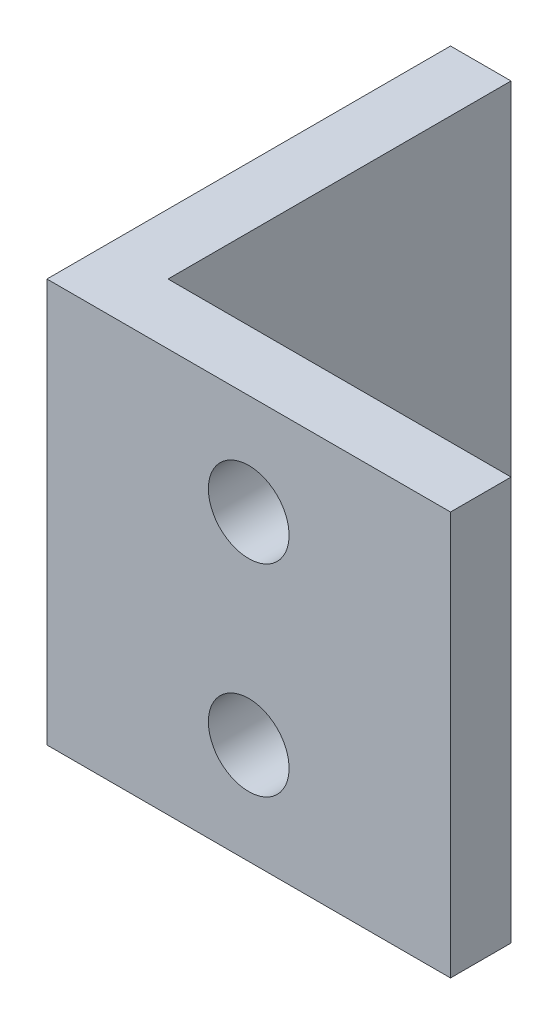
ISO-10303-21;
HEADER;
FILE_DESCRIPTION(('STEP AP214'),'2;1');
FILE_NAME('part.step','',(''),(''),'','','');
FILE_SCHEMA(('AUTOMOTIVE_DESIGN { 1 0 10303 214 1 1 1 1 }'));
ENDSEC;
DATA;
#1=APPLICATION_CONTEXT('core data for automotive mechanical design processes');
#2=APPLICATION_PROTOCOL_DEFINITION('international standard','automotive_design',2000,#1);
#3=PRODUCT_CONTEXT('',#1,'mechanical');
#4=PRODUCT('Part','Part','',(#3));
#5=PRODUCT_RELATED_PRODUCT_CATEGORY('part','',(#4));
#6=PRODUCT_DEFINITION_FORMATION('','',#4);
#7=PRODUCT_DEFINITION_CONTEXT('part definition',#1,'design');
#8=PRODUCT_DEFINITION('design','',#6,#7);
#9=PRODUCT_DEFINITION_SHAPE('','',#8);
#10=(LENGTH_UNIT() NAMED_UNIT(*) SI_UNIT(.MILLI.,.METRE.));
#11=(NAMED_UNIT(*) PLANE_ANGLE_UNIT() SI_UNIT($,.RADIAN.));
#12=(NAMED_UNIT(*) SI_UNIT($,.STERADIAN.) SOLID_ANGLE_UNIT());
#13=UNCERTAINTY_MEASURE_WITH_UNIT(LENGTH_MEASURE(1.E-05),#10,'distance_accuracy_value','');
#14=(GEOMETRIC_REPRESENTATION_CONTEXT(3) GLOBAL_UNCERTAINTY_ASSIGNED_CONTEXT((#13)) GLOBAL_UNIT_ASSIGNED_CONTEXT((#10,
#11,#12)) REPRESENTATION_CONTEXT('',''));
#15=CARTESIAN_POINT('',(0.,0.,0.));
#16=DIRECTION('',(0.,0.,1.));
#17=DIRECTION('',(1.,0.,0.));
#18=AXIS2_PLACEMENT_3D('',#15,#16,#17);
#19=CARTESIAN_POINT('',(39.,140.,20.));
#20=DIRECTION('',(0.,0.,1.));
#21=DIRECTION('',(1.,0.,0.));
#22=AXIS2_PLACEMENT_3D('',#19,#20,#21);
#23=PLANE('',#22);
#24=CARTESIAN_POINT('',(49.,145.,20.));
#25=DIRECTION('',(0.,0.,-1.));
#26=DIRECTION('',(-1.,0.,0.));
#27=AXIS2_PLACEMENT_3D('',#24,#25,#26);
#28=CIRCLE('',#27,1.99999999999999);
#29=CARTESIAN_POINT('',(47.,145.,20.));
#30=VERTEX_POINT('',#29);
#31=EDGE_CURVE('E152',#30,#30,#28,.T.);
#32=ORIENTED_EDGE('',*,*,#31,.T.);
#33=EDGE_LOOP('',(#32));
#34=FACE_BOUND('',#33,.T.);
#35=CARTESIAN_POINT('',(49.,155.,20.));
#36=DIRECTION('',(0.,0.,-1.));
#37=DIRECTION('',(-1.,0.,0.));
#38=AXIS2_PLACEMENT_3D('',#35,#36,#37);
#39=CIRCLE('',#38,1.99999999999999);
#40=CARTESIAN_POINT('',(47.,155.,20.));
#41=VERTEX_POINT('',#40);
#42=EDGE_CURVE('E146',#41,#41,#39,.T.);
#43=ORIENTED_EDGE('',*,*,#42,.T.);
#44=EDGE_LOOP('',(#43));
#45=FACE_BOUND('',#44,.T.);
#46=DIRECTION('',(1.,0.,0.));
#47=VECTOR('',#46,1.);
#48=CARTESIAN_POINT('',(39.,160.,20.));
#49=LINE('',#48,#47);
#50=CARTESIAN_POINT('',(39.,160.,20.));
#51=VERTEX_POINT('',#50);
#52=CARTESIAN_POINT('',(59.,160.,20.));
#53=VERTEX_POINT('',#52);
#54=EDGE_CURVE('E112',#51,#53,#49,.T.);
#55=ORIENTED_EDGE('',*,*,#54,.F.);
#56=DIRECTION('',(0.,1.,0.));
#57=VECTOR('',#56,1.);
#58=CARTESIAN_POINT('',(39.,140.,20.));
#59=LINE('',#58,#57);
#60=CARTESIAN_POINT('',(39.,140.,20.));
#61=VERTEX_POINT('',#60);
#62=EDGE_CURVE('E11',#61,#51,#59,.T.);
#63=ORIENTED_EDGE('',*,*,#62,.F.);
#64=DIRECTION('',(1.,0.,0.));
#65=VECTOR('',#64,1.);
#66=CARTESIAN_POINT('',(39.,140.,20.));
#67=LINE('',#66,#65);
#68=CARTESIAN_POINT('',(59.,140.,20.));
#69=VERTEX_POINT('',#68);
#70=EDGE_CURVE('E121',#61,#69,#67,.T.);
#71=ORIENTED_EDGE('',*,*,#70,.T.);
#72=DIRECTION('',(0.,1.,0.));
#73=VECTOR('',#72,1.);
#74=CARTESIAN_POINT('',(59.,140.,20.));
#75=LINE('',#74,#73);
#76=EDGE_CURVE('E38',#69,#53,#75,.T.);
#77=ORIENTED_EDGE('',*,*,#76,.T.);
#78=EDGE_LOOP('',(#55,#63,#71,#77));
#79=FACE_BOUND('',#78,.T.);
#80=ADVANCED_FACE('F35',(#34,#45,#79),#23,.T.);
#81=CARTESIAN_POINT('',(39.,140.,0.));
#82=DIRECTION('',(-1.,0.,0.));
#83=DIRECTION('',(0.,0.,1.));
#84=AXIS2_PLACEMENT_3D('',#81,#82,#83);
#85=PLANE('',#84);
#86=CARTESIAN_POINT('',(39.,150.,10.));
#87=DIRECTION('',(-1.,0.,0.));
#88=DIRECTION('',(0.,0.,1.));
#89=AXIS2_PLACEMENT_3D('',#86,#87,#88);
#90=CIRCLE('',#89,2.09999999999999);
#91=CARTESIAN_POINT('',(39.,150.,12.1));
#92=VERTEX_POINT('',#91);
#93=EDGE_CURVE('E143',#92,#92,#90,.T.);
#94=ORIENTED_EDGE('',*,*,#93,.F.);
#95=EDGE_LOOP('',(#94));
#96=FACE_BOUND('',#95,.T.);
#97=DIRECTION('',(0.,0.,1.));
#98=VECTOR('',#97,1.);
#99=CARTESIAN_POINT('',(39.,160.,0.));
#100=LINE('',#99,#98);
#101=CARTESIAN_POINT('',(39.,160.,0.));
#102=VERTEX_POINT('',#101);
#103=EDGE_CURVE('E115',#102,#51,#100,.T.);
#104=ORIENTED_EDGE('',*,*,#103,.F.);
#105=DIRECTION('',(0.,1.,0.));
#106=VECTOR('',#105,1.);
#107=CARTESIAN_POINT('',(39.,140.,0.));
#108=LINE('',#107,#106);
#109=CARTESIAN_POINT('',(39.,140.,0.));
#110=VERTEX_POINT('',#109);
#111=EDGE_CURVE('E43',#110,#102,#108,.T.);
#112=ORIENTED_EDGE('',*,*,#111,.F.);
#113=DIRECTION('',(0.,0.,1.));
#114=VECTOR('',#113,1.);
#115=CARTESIAN_POINT('',(39.,140.,0.));
#116=LINE('',#115,#114);
#117=EDGE_CURVE('E126',#110,#61,#116,.T.);
#118=ORIENTED_EDGE('',*,*,#117,.T.);
#119=ORIENTED_EDGE('',*,*,#62,.T.);
#120=EDGE_LOOP('',(#104,#112,#118,#119));
#121=FACE_BOUND('',#120,.T.);
#122=ADVANCED_FACE('F182',(#96,#121),#85,.T.);
#123=CARTESIAN_POINT('',(59.,140.,0.));
#124=DIRECTION('',(0.,0.,-1.));
#125=DIRECTION('',(-1.,0.,0.));
#126=AXIS2_PLACEMENT_3D('',#123,#124,#125);
#127=PLANE('',#126);
#128=DIRECTION('',(0.,-1.,0.));
#129=VECTOR('',#128,1.);
#130=CARTESIAN_POINT('',(42.,160.,0.));
#131=LINE('',#130,#129);
#132=CARTESIAN_POINT('',(42.,160.,0.));
#133=VERTEX_POINT('',#132);
#134=CARTESIAN_POINT('',(42.,140.,0.));
#135=VERTEX_POINT('',#134);
#136=EDGE_CURVE('E117',#133,#135,#131,.T.);
#137=ORIENTED_EDGE('',*,*,#136,.T.);
#138=DIRECTION('',(-1.,0.,0.));
#139=VECTOR('',#138,1.);
#140=CARTESIAN_POINT('',(59.,140.,0.));
#141=LINE('',#140,#139);
#142=EDGE_CURVE('E127',#135,#110,#141,.T.);
#143=ORIENTED_EDGE('',*,*,#142,.T.);
#144=ORIENTED_EDGE('',*,*,#111,.T.);
#145=DIRECTION('',(-1.,0.,0.));
#146=VECTOR('',#145,1.);
#147=CARTESIAN_POINT('',(59.,160.,0.));
#148=LINE('',#147,#146);
#149=EDGE_CURVE('E113',#133,#102,#148,.T.);
#150=ORIENTED_EDGE('',*,*,#149,.F.);
#151=EDGE_LOOP('',(#137,#143,#144,#150));
#152=FACE_BOUND('',#151,.T.);
#153=ADVANCED_FACE('F187',(#152),#127,.T.);
#154=CARTESIAN_POINT('',(59.,140.,20.));
#155=DIRECTION('',(1.,0.,0.));
#156=DIRECTION('',(0.,0.,-1.));
#157=AXIS2_PLACEMENT_3D('',#154,#155,#156);
#158=PLANE('',#157);
#159=DIRECTION('',(0.,-1.,0.));
#160=VECTOR('',#159,1.);
#161=CARTESIAN_POINT('',(59.,160.,17.));
#162=LINE('',#161,#160);
#163=CARTESIAN_POINT('',(59.,160.,17.));
#164=VERTEX_POINT('',#163);
#165=CARTESIAN_POINT('',(59.,140.,17.));
#166=VERTEX_POINT('',#165);
#167=EDGE_CURVE('E98',#164,#166,#162,.T.);
#168=ORIENTED_EDGE('',*,*,#167,.F.);
#169=DIRECTION('',(0.,0.,-1.));
#170=VECTOR('',#169,1.);
#171=CARTESIAN_POINT('',(59.,160.,20.));
#172=LINE('',#171,#170);
#173=EDGE_CURVE('E106',#53,#164,#172,.T.);
#174=ORIENTED_EDGE('',*,*,#173,.F.);
#175=ORIENTED_EDGE('',*,*,#76,.F.);
#176=DIRECTION('',(0.,0.,-1.));
#177=VECTOR('',#176,1.);
#178=CARTESIAN_POINT('',(59.,140.,20.));
#179=LINE('',#178,#177);
#180=EDGE_CURVE('E108',#69,#166,#179,.T.);
#181=ORIENTED_EDGE('',*,*,#180,.T.);
#182=EDGE_LOOP('',(#168,#174,#175,#181));
#183=FACE_BOUND('',#182,.T.);
#184=ADVANCED_FACE('F105',(#183),#158,.T.);
#185=CARTESIAN_POINT('',(0.,140.,0.));
#186=DIRECTION('',(0.,1.,0.));
#187=DIRECTION('',(0.,0.,1.));
#188=AXIS2_PLACEMENT_3D('',#185,#186,#187);
#189=PLANE('',#188);
#190=ORIENTED_EDGE('',*,*,#142,.F.);
#191=DIRECTION('',(0.,0.,-1.));
#192=VECTOR('',#191,1.);
#193=CARTESIAN_POINT('',(42.,140.,17.));
#194=LINE('',#193,#192);
#195=CARTESIAN_POINT('',(42.,140.,17.));
#196=VERTEX_POINT('',#195);
#197=EDGE_CURVE('E103',#196,#135,#194,.T.);
#198=ORIENTED_EDGE('',*,*,#197,.F.);
#199=DIRECTION('',(-1.,0.,0.));
#200=VECTOR('',#199,1.);
#201=CARTESIAN_POINT('',(59.,140.,17.));
#202=LINE('',#201,#200);
#203=EDGE_CURVE('E137',#166,#196,#202,.T.);
#204=ORIENTED_EDGE('',*,*,#203,.F.);
#205=ORIENTED_EDGE('',*,*,#180,.F.);
#206=ORIENTED_EDGE('',*,*,#70,.F.);
#207=ORIENTED_EDGE('',*,*,#117,.F.);
#208=EDGE_LOOP('',(#190,#198,#204,#205,#206,#207));
#209=FACE_BOUND('',#208,.T.);
#210=ADVANCED_FACE('F194',(#209),#189,.F.);
#211=CARTESIAN_POINT('',(0.,160.,0.));
#212=DIRECTION('',(0.,1.,0.));
#213=DIRECTION('',(0.,0.,1.));
#214=AXIS2_PLACEMENT_3D('',#211,#212,#213);
#215=PLANE('',#214);
#216=DIRECTION('',(0.,0.,-1.));
#217=VECTOR('',#216,1.);
#218=CARTESIAN_POINT('',(42.,160.,17.));
#219=LINE('',#218,#217);
#220=CARTESIAN_POINT('',(42.,160.,17.));
#221=VERTEX_POINT('',#220);
#222=EDGE_CURVE('E51',#221,#133,#219,.T.);
#223=ORIENTED_EDGE('',*,*,#222,.T.);
#224=ORIENTED_EDGE('',*,*,#149,.T.);
#225=ORIENTED_EDGE('',*,*,#103,.T.);
#226=ORIENTED_EDGE('',*,*,#54,.T.);
#227=ORIENTED_EDGE('',*,*,#173,.T.);
#228=DIRECTION('',(-1.,0.,0.));
#229=VECTOR('',#228,1.);
#230=CARTESIAN_POINT('',(59.,160.,17.));
#231=LINE('',#230,#229);
#232=EDGE_CURVE('E94',#164,#221,#231,.T.);
#233=ORIENTED_EDGE('',*,*,#232,.T.);
#234=EDGE_LOOP('',(#223,#224,#225,#226,#227,#233));
#235=FACE_BOUND('',#234,.T.);
#236=ADVANCED_FACE('F110',(#235),#215,.T.);
#237=CARTESIAN_POINT('',(42.,160.,17.));
#238=DIRECTION('',(-1.,0.,0.));
#239=DIRECTION('',(0.,0.,1.));
#240=AXIS2_PLACEMENT_3D('',#237,#238,#239);
#241=PLANE('',#240);
#242=CARTESIAN_POINT('',(42.,150.,10.));
#243=DIRECTION('',(-1.,0.,0.));
#244=DIRECTION('',(0.,0.,1.));
#245=AXIS2_PLACEMENT_3D('',#242,#243,#244);
#246=CIRCLE('',#245,2.09999999999999);
#247=CARTESIAN_POINT('',(42.,150.,12.1));
#248=VERTEX_POINT('',#247);
#249=EDGE_CURVE('E139',#248,#248,#246,.T.);
#250=ORIENTED_EDGE('',*,*,#249,.T.);
#251=EDGE_LOOP('',(#250));
#252=FACE_BOUND('',#251,.T.);
#253=ORIENTED_EDGE('',*,*,#197,.T.);
#254=ORIENTED_EDGE('',*,*,#136,.F.);
#255=ORIENTED_EDGE('',*,*,#222,.F.);
#256=DIRECTION('',(0.,-1.,0.));
#257=VECTOR('',#256,1.);
#258=CARTESIAN_POINT('',(42.,160.,17.));
#259=LINE('',#258,#257);
#260=EDGE_CURVE('E100',#221,#196,#259,.T.);
#261=ORIENTED_EDGE('',*,*,#260,.T.);
#262=EDGE_LOOP('',(#253,#254,#255,#261));
#263=FACE_BOUND('',#262,.T.);
#264=ADVANCED_FACE('F164',(#252,#263),#241,.F.);
#265=CARTESIAN_POINT('',(59.,160.,17.));
#266=DIRECTION('',(0.,0.,1.));
#267=DIRECTION('',(1.,0.,0.));
#268=AXIS2_PLACEMENT_3D('',#265,#266,#267);
#269=PLANE('',#268);
#270=CARTESIAN_POINT('',(49.,145.,17.));
#271=DIRECTION('',(0.,0.,-1.));
#272=DIRECTION('',(-1.,0.,0.));
#273=AXIS2_PLACEMENT_3D('',#270,#271,#272);
#274=CIRCLE('',#273,1.99999999999999);
#275=CARTESIAN_POINT('',(47.,145.,17.));
#276=VERTEX_POINT('',#275);
#277=EDGE_CURVE('E155',#276,#276,#274,.T.);
#278=ORIENTED_EDGE('',*,*,#277,.F.);
#279=EDGE_LOOP('',(#278));
#280=FACE_BOUND('',#279,.T.);
#281=CARTESIAN_POINT('',(49.,155.,17.));
#282=DIRECTION('',(0.,0.,-1.));
#283=DIRECTION('',(-1.,0.,0.));
#284=AXIS2_PLACEMENT_3D('',#281,#282,#283);
#285=CIRCLE('',#284,1.99999999999999);
#286=CARTESIAN_POINT('',(47.,155.,17.));
#287=VERTEX_POINT('',#286);
#288=EDGE_CURVE('E149',#287,#287,#285,.T.);
#289=ORIENTED_EDGE('',*,*,#288,.F.);
#290=EDGE_LOOP('',(#289));
#291=FACE_BOUND('',#290,.T.);
#292=ORIENTED_EDGE('',*,*,#203,.T.);
#293=ORIENTED_EDGE('',*,*,#260,.F.);
#294=ORIENTED_EDGE('',*,*,#232,.F.);
#295=ORIENTED_EDGE('',*,*,#167,.T.);
#296=EDGE_LOOP('',(#292,#293,#294,#295));
#297=FACE_BOUND('',#296,.T.);
#298=ADVANCED_FACE('F97',(#280,#291,#297),#269,.F.);
#299=CARTESIAN_POINT('',(39.,150.,10.));
#300=DIRECTION('',(-1.,0.,0.));
#301=DIRECTION('',(0.,0.,1.));
#302=AXIS2_PLACEMENT_3D('',#299,#300,#301);
#303=CYLINDRICAL_SURFACE('',#302,2.09999999999999);
#304=ORIENTED_EDGE('',*,*,#93,.T.);
#305=EDGE_LOOP('',(#304));
#306=FACE_BOUND('',#305,.T.);
#307=ORIENTED_EDGE('',*,*,#249,.F.);
#308=EDGE_LOOP('',(#307));
#309=FACE_BOUND('',#308,.T.);
#310=ADVANCED_FACE('F163',(#306,#309),#303,.F.);
#311=CARTESIAN_POINT('',(49.,155.,17.));
#312=DIRECTION('',(0.,0.,-1.));
#313=DIRECTION('',(-1.,0.,0.));
#314=AXIS2_PLACEMENT_3D('',#311,#312,#313);
#315=CYLINDRICAL_SURFACE('',#314,1.99999999999999);
#316=ORIENTED_EDGE('',*,*,#42,.F.);
#317=EDGE_LOOP('',(#316));
#318=FACE_BOUND('',#317,.T.);
#319=ORIENTED_EDGE('',*,*,#288,.T.);
#320=EDGE_LOOP('',(#319));
#321=FACE_BOUND('',#320,.T.);
#322=ADVANCED_FACE('F168',(#318,#321),#315,.F.);
#323=CARTESIAN_POINT('',(49.,145.,17.));
#324=DIRECTION('',(0.,0.,-1.));
#325=DIRECTION('',(-1.,0.,0.));
#326=AXIS2_PLACEMENT_3D('',#323,#324,#325);
#327=CYLINDRICAL_SURFACE('',#326,1.99999999999999);
#328=ORIENTED_EDGE('',*,*,#31,.F.);
#329=EDGE_LOOP('',(#328));
#330=FACE_BOUND('',#329,.T.);
#331=ORIENTED_EDGE('',*,*,#277,.T.);
#332=EDGE_LOOP('',(#331));
#333=FACE_BOUND('',#332,.T.);
#334=ADVANCED_FACE('F159',(#330,#333),#327,.F.);
#335=CLOSED_SHELL('',(#80,#122,#153,#184,#210,#236,#264,#298,#310,#322,#334));
#336=MANIFOLD_SOLID_BREP('B2',#335);
#337=ADVANCED_BREP_SHAPE_REPRESENTATION('',(#18,#336),#14);
#338=SHAPE_DEFINITION_REPRESENTATION(#9,#337);
ENDSEC;
END-ISO-10303-21;
